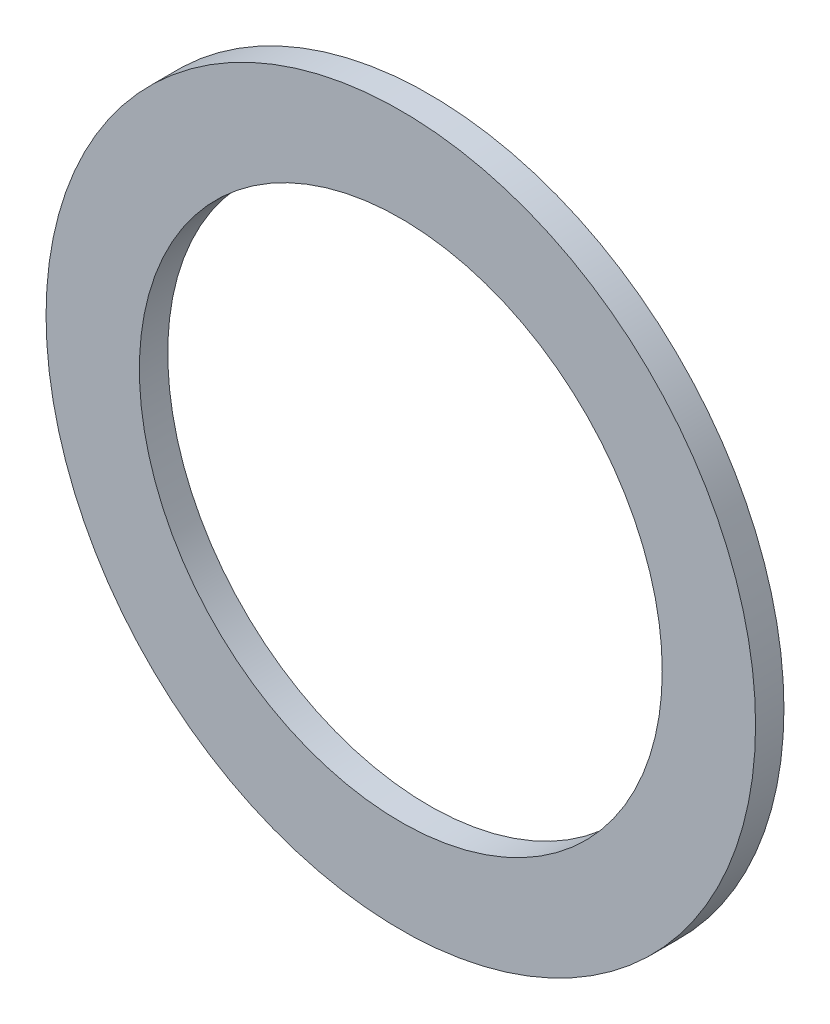
ISO-10303-21;
HEADER;
FILE_DESCRIPTION(('STEP AP214'),'2;1');
FILE_NAME('part.step','',(''),(''),'','','');
FILE_SCHEMA(('AUTOMOTIVE_DESIGN { 1 0 10303 214 1 1 1 1 }'));
ENDSEC;
DATA;
#1=APPLICATION_CONTEXT('core data for automotive mechanical design processes');
#2=APPLICATION_PROTOCOL_DEFINITION('international standard','automotive_design',2000,#1);
#3=PRODUCT_CONTEXT('',#1,'mechanical');
#4=PRODUCT('Part','Part','',(#3));
#5=PRODUCT_RELATED_PRODUCT_CATEGORY('part','',(#4));
#6=PRODUCT_DEFINITION_FORMATION('','',#4);
#7=PRODUCT_DEFINITION_CONTEXT('part definition',#1,'design');
#8=PRODUCT_DEFINITION('design','',#6,#7);
#9=PRODUCT_DEFINITION_SHAPE('','',#8);
#10=(LENGTH_UNIT() NAMED_UNIT(*) SI_UNIT(.MILLI.,.METRE.));
#11=(NAMED_UNIT(*) PLANE_ANGLE_UNIT() SI_UNIT($,.RADIAN.));
#12=(NAMED_UNIT(*) SI_UNIT($,.STERADIAN.) SOLID_ANGLE_UNIT());
#13=UNCERTAINTY_MEASURE_WITH_UNIT(LENGTH_MEASURE(1.E-05),#10,'distance_accuracy_value','');
#14=(GEOMETRIC_REPRESENTATION_CONTEXT(3) GLOBAL_UNCERTAINTY_ASSIGNED_CONTEXT((#13)) GLOBAL_UNIT_ASSIGNED_CONTEXT((#10,
#11,#12)) REPRESENTATION_CONTEXT('',''));
#15=CARTESIAN_POINT('',(0.,0.,0.));
#16=DIRECTION('',(0.,0.,1.));
#17=DIRECTION('',(1.,0.,0.));
#18=AXIS2_PLACEMENT_3D('',#15,#16,#17);
#19=CARTESIAN_POINT('',(0.,0.,1.6));
#20=DIRECTION('',(0.,0.,1.));
#21=DIRECTION('',(1.,0.,0.));
#22=AXIS2_PLACEMENT_3D('',#19,#20,#21);
#23=PLANE('',#22);
#24=CARTESIAN_POINT('',(0.,0.,1.6));
#25=DIRECTION('',(0.,0.,1.));
#26=DIRECTION('',(1.,0.,0.));
#27=AXIS2_PLACEMENT_3D('',#24,#25,#26);
#28=CIRCLE('',#27,14.7394677069675);
#29=CARTESIAN_POINT('',(14.7394677069675,0.,1.6));
#30=VERTEX_POINT('',#29);
#31=EDGE_CURVE('E46',#30,#30,#28,.T.);
#32=ORIENTED_EDGE('',*,*,#31,.F.);
#33=EDGE_LOOP('',(#32));
#34=FACE_BOUND('',#33,.T.);
#35=CARTESIAN_POINT('',(0.,0.,1.6));
#36=DIRECTION('',(0.,0.,1.));
#37=DIRECTION('',(1.,0.,0.));
#38=AXIS2_PLACEMENT_3D('',#35,#36,#37);
#39=CIRCLE('',#38,20.);
#40=CARTESIAN_POINT('',(20.,0.,1.6));
#41=VERTEX_POINT('',#40);
#42=EDGE_CURVE('E10',#41,#41,#39,.T.);
#43=ORIENTED_EDGE('',*,*,#42,.T.);
#44=EDGE_LOOP('',(#43));
#45=FACE_BOUND('',#44,.T.);
#46=ADVANCED_FACE('F31',(#34,#45),#23,.T.);
#47=CARTESIAN_POINT('',(0.,0.,0.));
#48=DIRECTION('',(0.,0.,1.));
#49=DIRECTION('',(1.,0.,0.));
#50=AXIS2_PLACEMENT_3D('',#47,#48,#49);
#51=PLANE('',#50);
#52=CARTESIAN_POINT('',(0.,0.,0.));
#53=DIRECTION('',(0.,0.,1.));
#54=DIRECTION('',(1.,0.,0.));
#55=AXIS2_PLACEMENT_3D('',#52,#53,#54);
#56=CIRCLE('',#55,14.7394677069675);
#57=CARTESIAN_POINT('',(14.7394677069675,0.,0.));
#58=VERTEX_POINT('',#57);
#59=EDGE_CURVE('E42',#58,#58,#56,.F.);
#60=ORIENTED_EDGE('',*,*,#59,.F.);
#61=EDGE_LOOP('',(#60));
#62=FACE_BOUND('',#61,.T.);
#63=CARTESIAN_POINT('',(0.,0.,0.));
#64=DIRECTION('',(0.,0.,1.));
#65=DIRECTION('',(1.,0.,0.));
#66=AXIS2_PLACEMENT_3D('',#63,#64,#65);
#67=CIRCLE('',#66,20.);
#68=CARTESIAN_POINT('',(20.,0.,0.));
#69=VERTEX_POINT('',#68);
#70=EDGE_CURVE('E38',#69,#69,#67,.T.);
#71=ORIENTED_EDGE('',*,*,#70,.F.);
#72=EDGE_LOOP('',(#71));
#73=FACE_BOUND('',#72,.T.);
#74=ADVANCED_FACE('F56',(#62,#73),#51,.F.);
#75=CARTESIAN_POINT('',(0.,0.,1.6));
#76=DIRECTION('',(0.,0.,-1.));
#77=DIRECTION('',(-1.,0.,0.));
#78=AXIS2_PLACEMENT_3D('',#75,#76,#77);
#79=CYLINDRICAL_SURFACE('',#78,20.);
#80=ORIENTED_EDGE('',*,*,#42,.F.);
#81=EDGE_LOOP('',(#80));
#82=FACE_BOUND('',#81,.T.);
#83=ORIENTED_EDGE('',*,*,#70,.T.);
#84=EDGE_LOOP('',(#83));
#85=FACE_BOUND('',#84,.T.);
#86=ADVANCED_FACE('F33',(#82,#85),#79,.T.);
#87=CARTESIAN_POINT('',(0.,0.,-10.7101584833935));
#88=DIRECTION('',(0.,0.,1.));
#89=DIRECTION('',(1.,0.,0.));
#90=AXIS2_PLACEMENT_3D('',#87,#88,#89);
#91=CYLINDRICAL_SURFACE('',#90,14.7394677069675);
#92=ORIENTED_EDGE('',*,*,#31,.T.);
#93=EDGE_LOOP('',(#92));
#94=FACE_BOUND('',#93,.T.);
#95=ORIENTED_EDGE('',*,*,#59,.T.);
#96=EDGE_LOOP('',(#95));
#97=FACE_BOUND('',#96,.T.);
#98=ADVANCED_FACE('F52',(#94,#97),#91,.F.);
#99=CLOSED_SHELL('',(#46,#74,#86,#98));
#100=MANIFOLD_SOLID_BREP('B2',#99);
#101=ADVANCED_BREP_SHAPE_REPRESENTATION('',(#18,#100),#14);
#102=SHAPE_DEFINITION_REPRESENTATION(#9,#101);
ENDSEC;
END-ISO-10303-21;
